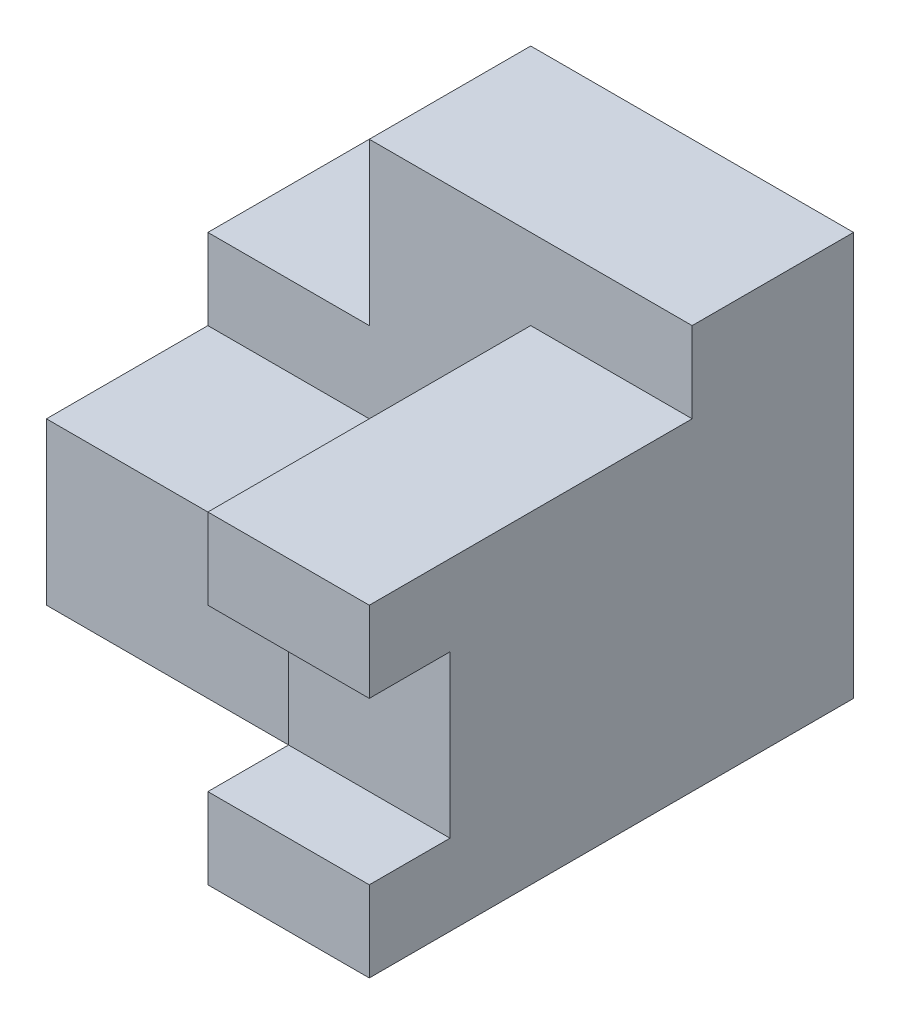
ISO-10303-21;
HEADER;
FILE_DESCRIPTION(('STEP AP214'),'2;1');
FILE_NAME('part.step','',(''),(''),'','','');
FILE_SCHEMA(('AUTOMOTIVE_DESIGN { 1 0 10303 214 1 1 1 1 }'));
ENDSEC;
DATA;
#1=APPLICATION_CONTEXT('core data for automotive mechanical design processes');
#2=APPLICATION_PROTOCOL_DEFINITION('international standard','automotive_design',2000,#1);
#3=PRODUCT_CONTEXT('',#1,'mechanical');
#4=PRODUCT('Part','Part','',(#3));
#5=PRODUCT_RELATED_PRODUCT_CATEGORY('part','',(#4));
#6=PRODUCT_DEFINITION_FORMATION('','',#4);
#7=PRODUCT_DEFINITION_CONTEXT('part definition',#1,'design');
#8=PRODUCT_DEFINITION('design','',#6,#7);
#9=PRODUCT_DEFINITION_SHAPE('','',#8);
#10=(LENGTH_UNIT() NAMED_UNIT(*) SI_UNIT(.MILLI.,.METRE.));
#11=(NAMED_UNIT(*) PLANE_ANGLE_UNIT() SI_UNIT($,.RADIAN.));
#12=(NAMED_UNIT(*) SI_UNIT($,.STERADIAN.) SOLID_ANGLE_UNIT());
#13=UNCERTAINTY_MEASURE_WITH_UNIT(LENGTH_MEASURE(1.E-05),#10,'distance_accuracy_value','');
#14=(GEOMETRIC_REPRESENTATION_CONTEXT(3) GLOBAL_UNCERTAINTY_ASSIGNED_CONTEXT((#13)) GLOBAL_UNIT_ASSIGNED_CONTEXT((#10,
#11,#12)) REPRESENTATION_CONTEXT('',''));
#15=CARTESIAN_POINT('',(0.,0.,0.));
#16=DIRECTION('',(0.,0.,1.));
#17=DIRECTION('',(1.,0.,0.));
#18=AXIS2_PLACEMENT_3D('',#15,#16,#17);
#19=CARTESIAN_POINT('',(0.,-20.,40.));
#20=DIRECTION('',(0.,-1.,0.));
#21=DIRECTION('',(1.,0.,0.));
#22=AXIS2_PLACEMENT_3D('',#19,#20,#21);
#23=PLANE('',#22);
#24=DIRECTION('',(1.,0.,0.));
#25=VECTOR('',#24,1.);
#26=CARTESIAN_POINT('',(-40.,-20.,-40.));
#27=LINE('',#26,#25);
#28=CARTESIAN_POINT('',(-120.,-20.,-40.));
#29=VERTEX_POINT('',#28);
#30=CARTESIAN_POINT('',(40.,-20.,-40.));
#31=VERTEX_POINT('',#30);
#32=EDGE_CURVE('E51',#29,#31,#27,.T.);
#33=ORIENTED_EDGE('',*,*,#32,.F.);
#34=DIRECTION('',(0.,0.,-1.));
#35=VECTOR('',#34,1.);
#36=CARTESIAN_POINT('',(-120.,-20.,40.));
#37=LINE('',#36,#35);
#38=CARTESIAN_POINT('',(-120.,-20.,40.));
#39=VERTEX_POINT('',#38);
#40=EDGE_CURVE('E159',#39,#29,#37,.T.);
#41=ORIENTED_EDGE('',*,*,#40,.F.);
#42=DIRECTION('',(-1.,0.,0.));
#43=VECTOR('',#42,1.);
#44=CARTESIAN_POINT('',(0.,-20.,40.));
#45=LINE('',#44,#43);
#46=CARTESIAN_POINT('',(40.,-20.,40.));
#47=VERTEX_POINT('',#46);
#48=EDGE_CURVE('E256',#47,#39,#45,.T.);
#49=ORIENTED_EDGE('',*,*,#48,.F.);
#50=DIRECTION('',(0.,0.,-1.));
#51=VECTOR('',#50,1.);
#52=CARTESIAN_POINT('',(40.,-20.,40.));
#53=LINE('',#52,#51);
#54=EDGE_CURVE('E271',#47,#31,#53,.T.);
#55=ORIENTED_EDGE('',*,*,#54,.T.);
#56=EDGE_LOOP('',(#33,#41,#49,#55));
#57=FACE_BOUND('',#56,.T.);
#58=ADVANCED_FACE('F34',(#57),#23,.F.);
#59=CARTESIAN_POINT('',(-40.,0.,0.));
#60=DIRECTION('',(-1.,0.,0.));
#61=DIRECTION('',(0.,-1.,0.));
#62=AXIS2_PLACEMENT_3D('',#59,#60,#61);
#63=PLANE('',#62);
#64=DIRECTION('',(0.,-1.,0.));
#65=VECTOR('',#64,1.);
#66=CARTESIAN_POINT('',(-40.,100.,-120.));
#67=LINE('',#66,#65);
#68=CARTESIAN_POINT('',(-40.,100.,-120.));
#69=VERTEX_POINT('',#68);
#70=CARTESIAN_POINT('',(-40.,20.,-120.));
#71=VERTEX_POINT('',#70);
#72=EDGE_CURVE('E175',#69,#71,#67,.T.);
#73=ORIENTED_EDGE('',*,*,#72,.T.);
#74=DIRECTION('',(0.,0.,-1.));
#75=VECTOR('',#74,1.);
#76=CARTESIAN_POINT('',(-40.,20.,-40.));
#77=LINE('',#76,#75);
#78=CARTESIAN_POINT('',(-40.,20.,-40.));
#79=VERTEX_POINT('',#78);
#80=EDGE_CURVE('E59',#79,#71,#77,.T.);
#81=ORIENTED_EDGE('',*,*,#80,.F.);
#82=DIRECTION('',(0.,1.,0.));
#83=VECTOR('',#82,1.);
#84=CARTESIAN_POINT('',(-40.,100.,-40.));
#85=LINE('',#84,#83);
#86=CARTESIAN_POINT('',(-40.,100.,-40.));
#87=VERTEX_POINT('',#86);
#88=EDGE_CURVE('E165',#79,#87,#85,.T.);
#89=ORIENTED_EDGE('',*,*,#88,.T.);
#90=DIRECTION('',(0.,0.,-1.));
#91=VECTOR('',#90,1.);
#92=CARTESIAN_POINT('',(-40.,100.,-40.));
#93=LINE('',#92,#91);
#94=EDGE_CURVE('E168',#87,#69,#93,.T.);
#95=ORIENTED_EDGE('',*,*,#94,.T.);
#96=EDGE_LOOP('',(#73,#81,#89,#95));
#97=FACE_BOUND('',#96,.T.);
#98=ADVANCED_FACE('F300',(#97),#63,.T.);
#99=CARTESIAN_POINT('',(40.,0.,120.));
#100=DIRECTION('',(1.,0.,0.));
#101=DIRECTION('',(0.,1.,0.));
#102=AXIS2_PLACEMENT_3D('',#99,#100,#101);
#103=PLANE('',#102);
#104=DIRECTION('',(0.,1.,0.));
#105=VECTOR('',#104,1.);
#106=CARTESIAN_POINT('',(40.,100.,-40.));
#107=LINE('',#106,#105);
#108=CARTESIAN_POINT('',(40.,60.,-40.));
#109=VERTEX_POINT('',#108);
#110=EDGE_CURVE('E166',#31,#109,#107,.T.);
#111=ORIENTED_EDGE('',*,*,#110,.F.);
#112=ORIENTED_EDGE('',*,*,#54,.F.);
#113=DIRECTION('',(0.,1.,0.));
#114=VECTOR('',#113,1.);
#115=CARTESIAN_POINT('',(40.,0.,40.));
#116=LINE('',#115,#114);
#117=CARTESIAN_POINT('',(40.,-100.,40.));
#118=VERTEX_POINT('',#117);
#119=EDGE_CURVE('E241',#118,#47,#116,.T.);
#120=ORIENTED_EDGE('',*,*,#119,.F.);
#121=DIRECTION('',(0.,0.,-1.));
#122=VECTOR('',#121,1.);
#123=CARTESIAN_POINT('',(40.,-100.,120.));
#124=LINE('',#123,#122);
#125=CARTESIAN_POINT('',(40.,-100.,120.));
#126=VERTEX_POINT('',#125);
#127=EDGE_CURVE('E43',#126,#118,#124,.T.);
#128=ORIENTED_EDGE('',*,*,#127,.F.);
#129=DIRECTION('',(0.,-1.,0.));
#130=VECTOR('',#129,1.);
#131=CARTESIAN_POINT('',(40.,0.,120.));
#132=LINE('',#131,#130);
#133=CARTESIAN_POINT('',(40.,-60.,120.));
#134=VERTEX_POINT('',#133);
#135=EDGE_CURVE('E276',#134,#126,#132,.T.);
#136=ORIENTED_EDGE('',*,*,#135,.F.);
#137=DIRECTION('',(0.,0.,-1.));
#138=VECTOR('',#137,1.);
#139=CARTESIAN_POINT('',(40.,-60.,120.));
#140=LINE('',#139,#138);
#141=CARTESIAN_POINT('',(40.,-60.,80.));
#142=VERTEX_POINT('',#141);
#143=EDGE_CURVE('E11',#134,#142,#140,.T.);
#144=ORIENTED_EDGE('',*,*,#143,.T.);
#145=DIRECTION('',(0.,1.,0.));
#146=VECTOR('',#145,1.);
#147=CARTESIAN_POINT('',(40.,0.,80.));
#148=LINE('',#147,#146);
#149=CARTESIAN_POINT('',(40.,20.,80.));
#150=VERTEX_POINT('',#149);
#151=EDGE_CURVE('E232',#142,#150,#148,.T.);
#152=ORIENTED_EDGE('',*,*,#151,.T.);
#153=DIRECTION('',(0.,0.,-1.));
#154=VECTOR('',#153,1.);
#155=CARTESIAN_POINT('',(40.,20.,120.));
#156=LINE('',#155,#154);
#157=CARTESIAN_POINT('',(40.,20.,120.));
#158=VERTEX_POINT('',#157);
#159=EDGE_CURVE('E250',#158,#150,#156,.T.);
#160=ORIENTED_EDGE('',*,*,#159,.F.);
#161=DIRECTION('',(0.,1.,0.));
#162=VECTOR('',#161,1.);
#163=CARTESIAN_POINT('',(40.,0.,120.));
#164=LINE('',#163,#162);
#165=CARTESIAN_POINT('',(40.,60.,120.));
#166=VERTEX_POINT('',#165);
#167=EDGE_CURVE('E216',#158,#166,#164,.T.);
#168=ORIENTED_EDGE('',*,*,#167,.T.);
#169=DIRECTION('',(0.,0.,-1.));
#170=VECTOR('',#169,1.);
#171=CARTESIAN_POINT('',(40.,60.,120.));
#172=LINE('',#171,#170);
#173=EDGE_CURVE('E196',#166,#109,#172,.T.);
#174=ORIENTED_EDGE('',*,*,#173,.T.);
#175=EDGE_LOOP('',(#111,#112,#120,#128,#136,#144,#152,#160,#168,#174));
#176=FACE_BOUND('',#175,.T.);
#177=ADVANCED_FACE('F295',(#176),#103,.F.);
#178=CARTESIAN_POINT('',(0.,-60.,120.));
#179=DIRECTION('',(0.,-1.,0.));
#180=DIRECTION('',(1.,0.,0.));
#181=AXIS2_PLACEMENT_3D('',#178,#179,#180);
#182=PLANE('',#181);
#183=DIRECTION('',(0.,0.,-1.));
#184=VECTOR('',#183,1.);
#185=CARTESIAN_POINT('',(120.,-60.,120.));
#186=LINE('',#185,#184);
#187=CARTESIAN_POINT('',(120.,-60.,120.));
#188=VERTEX_POINT('',#187);
#189=CARTESIAN_POINT('',(120.,-60.,80.));
#190=VERTEX_POINT('',#189);
#191=EDGE_CURVE('E282',#188,#190,#186,.T.);
#192=ORIENTED_EDGE('',*,*,#191,.T.);
#193=DIRECTION('',(-1.,0.,0.));
#194=VECTOR('',#193,1.);
#195=CARTESIAN_POINT('',(0.,-60.,80.));
#196=LINE('',#195,#194);
#197=EDGE_CURVE('E235',#190,#142,#196,.T.);
#198=ORIENTED_EDGE('',*,*,#197,.T.);
#199=ORIENTED_EDGE('',*,*,#143,.F.);
#200=DIRECTION('',(-1.,0.,0.));
#201=VECTOR('',#200,1.);
#202=CARTESIAN_POINT('',(0.,-60.,120.));
#203=LINE('',#202,#201);
#204=EDGE_CURVE('E273',#188,#134,#203,.T.);
#205=ORIENTED_EDGE('',*,*,#204,.F.);
#206=EDGE_LOOP('',(#192,#198,#199,#205));
#207=FACE_BOUND('',#206,.T.);
#208=ADVANCED_FACE('F36',(#207),#182,.F.);
#209=CARTESIAN_POINT('',(0.,-100.,120.));
#210=DIRECTION('',(0.,1.,0.));
#211=DIRECTION('',(0.,0.,1.));
#212=AXIS2_PLACEMENT_3D('',#209,#210,#211);
#213=PLANE('',#212);
#214=DIRECTION('',(0.,0.,-1.));
#215=VECTOR('',#214,1.);
#216=CARTESIAN_POINT('',(-120.,-100.,40.));
#217=LINE('',#216,#215);
#218=CARTESIAN_POINT('',(-120.,-100.,40.));
#219=VERTEX_POINT('',#218);
#220=CARTESIAN_POINT('',(-120.,-100.,-120.));
#221=VERTEX_POINT('',#220);
#222=EDGE_CURVE('E263',#219,#221,#217,.T.);
#223=ORIENTED_EDGE('',*,*,#222,.T.);
#224=DIRECTION('',(1.,0.,0.));
#225=VECTOR('',#224,1.);
#226=CARTESIAN_POINT('',(0.,-100.,-120.));
#227=LINE('',#226,#225);
#228=CARTESIAN_POINT('',(120.,-100.,-120.));
#229=VERTEX_POINT('',#228);
#230=EDGE_CURVE('E204',#221,#229,#227,.T.);
#231=ORIENTED_EDGE('',*,*,#230,.T.);
#232=DIRECTION('',(0.,0.,-1.));
#233=VECTOR('',#232,1.);
#234=CARTESIAN_POINT('',(120.,-100.,120.));
#235=LINE('',#234,#233);
#236=CARTESIAN_POINT('',(120.,-100.,120.));
#237=VERTEX_POINT('',#236);
#238=EDGE_CURVE('E285',#237,#229,#235,.T.);
#239=ORIENTED_EDGE('',*,*,#238,.F.);
#240=DIRECTION('',(1.,0.,0.));
#241=VECTOR('',#240,1.);
#242=CARTESIAN_POINT('',(0.,-100.,120.));
#243=LINE('',#242,#241);
#244=EDGE_CURVE('E278',#126,#237,#243,.T.);
#245=ORIENTED_EDGE('',*,*,#244,.F.);
#246=ORIENTED_EDGE('',*,*,#127,.T.);
#247=DIRECTION('',(1.,0.,0.));
#248=VECTOR('',#247,1.);
#249=CARTESIAN_POINT('',(0.,-100.,40.));
#250=LINE('',#249,#248);
#251=EDGE_CURVE('E261',#219,#118,#250,.T.);
#252=ORIENTED_EDGE('',*,*,#251,.F.);
#253=EDGE_LOOP('',(#223,#231,#239,#245,#246,#252));
#254=FACE_BOUND('',#253,.T.);
#255=ADVANCED_FACE('F292',(#254),#213,.F.);
#256=CARTESIAN_POINT('',(120.,0.,120.));
#257=DIRECTION('',(-1.,0.,0.));
#258=DIRECTION('',(0.,0.,1.));
#259=AXIS2_PLACEMENT_3D('',#256,#257,#258);
#260=PLANE('',#259);
#261=ORIENTED_EDGE('',*,*,#238,.T.);
#262=DIRECTION('',(0.,1.,0.));
#263=VECTOR('',#262,1.);
#264=CARTESIAN_POINT('',(120.,0.,-120.));
#265=LINE('',#264,#263);
#266=CARTESIAN_POINT('',(120.,100.,-120.));
#267=VERTEX_POINT('',#266);
#268=EDGE_CURVE('E208',#229,#267,#265,.T.);
#269=ORIENTED_EDGE('',*,*,#268,.T.);
#270=DIRECTION('',(0.,0.,-1.));
#271=VECTOR('',#270,1.);
#272=CARTESIAN_POINT('',(120.,100.,-120.));
#273=LINE('',#272,#271);
#274=CARTESIAN_POINT('',(120.,100.,-40.));
#275=VERTEX_POINT('',#274);
#276=EDGE_CURVE('E181',#275,#267,#273,.T.);
#277=ORIENTED_EDGE('',*,*,#276,.F.);
#278=DIRECTION('',(0.,-1.,0.));
#279=VECTOR('',#278,1.);
#280=CARTESIAN_POINT('',(120.,100.,-40.));
#281=LINE('',#280,#279);
#282=CARTESIAN_POINT('',(120.,60.,-40.));
#283=VERTEX_POINT('',#282);
#284=EDGE_CURVE('E189',#275,#283,#281,.T.);
#285=ORIENTED_EDGE('',*,*,#284,.T.);
#286=DIRECTION('',(0.,0.,-1.));
#287=VECTOR('',#286,1.);
#288=CARTESIAN_POINT('',(120.,60.,120.));
#289=LINE('',#288,#287);
#290=CARTESIAN_POINT('',(120.,60.,120.));
#291=VERTEX_POINT('',#290);
#292=EDGE_CURVE('E223',#291,#283,#289,.T.);
#293=ORIENTED_EDGE('',*,*,#292,.F.);
#294=DIRECTION('',(0.,1.,0.));
#295=VECTOR('',#294,1.);
#296=CARTESIAN_POINT('',(120.,0.,120.));
#297=LINE('',#296,#295);
#298=CARTESIAN_POINT('',(120.,20.,120.));
#299=VERTEX_POINT('',#298);
#300=EDGE_CURVE('E221',#299,#291,#297,.T.);
#301=ORIENTED_EDGE('',*,*,#300,.F.);
#302=DIRECTION('',(0.,0.,-1.));
#303=VECTOR('',#302,1.);
#304=CARTESIAN_POINT('',(120.,20.,120.));
#305=LINE('',#304,#303);
#306=CARTESIAN_POINT('',(120.,20.,80.));
#307=VERTEX_POINT('',#306);
#308=EDGE_CURVE('E229',#299,#307,#305,.T.);
#309=ORIENTED_EDGE('',*,*,#308,.T.);
#310=DIRECTION('',(0.,1.,0.));
#311=VECTOR('',#310,1.);
#312=CARTESIAN_POINT('',(120.,0.,80.));
#313=LINE('',#312,#311);
#314=EDGE_CURVE('E239',#190,#307,#313,.T.);
#315=ORIENTED_EDGE('',*,*,#314,.F.);
#316=ORIENTED_EDGE('',*,*,#191,.F.);
#317=DIRECTION('',(0.,1.,0.));
#318=VECTOR('',#317,1.);
#319=CARTESIAN_POINT('',(120.,0.,120.));
#320=LINE('',#319,#318);
#321=EDGE_CURVE('E280',#237,#188,#320,.T.);
#322=ORIENTED_EDGE('',*,*,#321,.F.);
#323=EDGE_LOOP('',(#261,#269,#277,#285,#293,#301,#309,#315,#316,#322));
#324=FACE_BOUND('',#323,.T.);
#325=ADVANCED_FACE('F312',(#324),#260,.F.);
#326=CARTESIAN_POINT('',(0.,0.,120.));
#327=DIRECTION('',(0.,0.,1.));
#328=DIRECTION('',(1.,0.,0.));
#329=AXIS2_PLACEMENT_3D('',#326,#327,#328);
#330=PLANE('',#329);
#331=ORIENTED_EDGE('',*,*,#204,.T.);
#332=ORIENTED_EDGE('',*,*,#135,.T.);
#333=ORIENTED_EDGE('',*,*,#244,.T.);
#334=ORIENTED_EDGE('',*,*,#321,.T.);
#335=EDGE_LOOP('',(#331,#332,#333,#334));
#336=FACE_BOUND('',#335,.T.);
#337=ADVANCED_FACE('F309',(#336),#330,.T.);
#338=CARTESIAN_POINT('',(-120.,0.,40.));
#339=DIRECTION('',(-1.,0.,0.));
#340=DIRECTION('',(0.,0.,1.));
#341=AXIS2_PLACEMENT_3D('',#338,#339,#340);
#342=PLANE('',#341);
#343=ORIENTED_EDGE('',*,*,#40,.T.);
#344=DIRECTION('',(0.,1.,0.));
#345=VECTOR('',#344,1.);
#346=CARTESIAN_POINT('',(-120.,-20.,-40.));
#347=LINE('',#346,#345);
#348=CARTESIAN_POINT('',(-120.,20.,-40.));
#349=VERTEX_POINT('',#348);
#350=EDGE_CURVE('E154',#29,#349,#347,.T.);
#351=ORIENTED_EDGE('',*,*,#350,.T.);
#352=DIRECTION('',(0.,0.,-1.));
#353=VECTOR('',#352,1.);
#354=CARTESIAN_POINT('',(-120.,20.,-40.));
#355=LINE('',#354,#353);
#356=CARTESIAN_POINT('',(-120.,20.,-120.));
#357=VERTEX_POINT('',#356);
#358=EDGE_CURVE('E145',#349,#357,#355,.T.);
#359=ORIENTED_EDGE('',*,*,#358,.T.);
#360=DIRECTION('',(0.,1.,0.));
#361=VECTOR('',#360,1.);
#362=CARTESIAN_POINT('',(-120.,0.,-120.));
#363=LINE('',#362,#361);
#364=EDGE_CURVE('E192',#221,#357,#363,.T.);
#365=ORIENTED_EDGE('',*,*,#364,.F.);
#366=ORIENTED_EDGE('',*,*,#222,.F.);
#367=DIRECTION('',(0.,1.,0.));
#368=VECTOR('',#367,1.);
#369=CARTESIAN_POINT('',(-120.,0.,40.));
#370=LINE('',#369,#368);
#371=EDGE_CURVE('E264',#219,#39,#370,.T.);
#372=ORIENTED_EDGE('',*,*,#371,.T.);
#373=EDGE_LOOP('',(#343,#351,#359,#365,#366,#372));
#374=FACE_BOUND('',#373,.T.);
#375=ADVANCED_FACE('F157',(#374),#342,.T.);
#376=CARTESIAN_POINT('',(0.,0.,40.));
#377=DIRECTION('',(0.,0.,1.));
#378=DIRECTION('',(1.,0.,0.));
#379=AXIS2_PLACEMENT_3D('',#376,#377,#378);
#380=PLANE('',#379);
#381=ORIENTED_EDGE('',*,*,#119,.T.);
#382=ORIENTED_EDGE('',*,*,#48,.T.);
#383=ORIENTED_EDGE('',*,*,#371,.F.);
#384=ORIENTED_EDGE('',*,*,#251,.T.);
#385=EDGE_LOOP('',(#381,#382,#383,#384));
#386=FACE_BOUND('',#385,.T.);
#387=ADVANCED_FACE('F298',(#386),#380,.T.);
#388=CARTESIAN_POINT('',(0.,0.,80.));
#389=DIRECTION('',(0.,0.,1.));
#390=DIRECTION('',(1.,0.,0.));
#391=AXIS2_PLACEMENT_3D('',#388,#389,#390);
#392=PLANE('',#391);
#393=DIRECTION('',(1.,0.,0.));
#394=VECTOR('',#393,1.);
#395=CARTESIAN_POINT('',(0.,20.,80.));
#396=LINE('',#395,#394);
#397=EDGE_CURVE('E236',#150,#307,#396,.T.);
#398=ORIENTED_EDGE('',*,*,#397,.F.);
#399=ORIENTED_EDGE('',*,*,#151,.F.);
#400=ORIENTED_EDGE('',*,*,#197,.F.);
#401=ORIENTED_EDGE('',*,*,#314,.T.);
#402=EDGE_LOOP('',(#398,#399,#400,#401));
#403=FACE_BOUND('',#402,.T.);
#404=ADVANCED_FACE('F332',(#403),#392,.T.);
#405=CARTESIAN_POINT('',(0.,20.,120.));
#406=DIRECTION('',(0.,1.,0.));
#407=DIRECTION('',(-1.,0.,0.));
#408=AXIS2_PLACEMENT_3D('',#405,#406,#407);
#409=PLANE('',#408);
#410=ORIENTED_EDGE('',*,*,#159,.T.);
#411=ORIENTED_EDGE('',*,*,#397,.T.);
#412=ORIENTED_EDGE('',*,*,#308,.F.);
#413=DIRECTION('',(1.,0.,0.));
#414=VECTOR('',#413,1.);
#415=CARTESIAN_POINT('',(0.,20.,120.));
#416=LINE('',#415,#414);
#417=EDGE_CURVE('E219',#158,#299,#416,.T.);
#418=ORIENTED_EDGE('',*,*,#417,.F.);
#419=EDGE_LOOP('',(#410,#411,#412,#418));
#420=FACE_BOUND('',#419,.T.);
#421=ADVANCED_FACE('F336',(#420),#409,.F.);
#422=CARTESIAN_POINT('',(0.,60.,120.));
#423=DIRECTION('',(0.,1.,0.));
#424=DIRECTION('',(-1.,0.,0.));
#425=AXIS2_PLACEMENT_3D('',#422,#423,#424);
#426=PLANE('',#425);
#427=DIRECTION('',(1.,0.,0.));
#428=VECTOR('',#427,1.);
#429=CARTESIAN_POINT('',(120.,60.,-40.));
#430=LINE('',#429,#428);
#431=EDGE_CURVE('E185',#109,#283,#430,.T.);
#432=ORIENTED_EDGE('',*,*,#431,.F.);
#433=ORIENTED_EDGE('',*,*,#173,.F.);
#434=DIRECTION('',(1.,0.,0.));
#435=VECTOR('',#434,1.);
#436=CARTESIAN_POINT('',(0.,60.,120.));
#437=LINE('',#436,#435);
#438=EDGE_CURVE('E211',#166,#291,#437,.T.);
#439=ORIENTED_EDGE('',*,*,#438,.T.);
#440=ORIENTED_EDGE('',*,*,#292,.T.);
#441=EDGE_LOOP('',(#432,#433,#439,#440));
#442=FACE_BOUND('',#441,.T.);
#443=ADVANCED_FACE('F344',(#442),#426,.T.);
#444=CARTESIAN_POINT('',(0.,0.,120.));
#445=DIRECTION('',(0.,0.,1.));
#446=DIRECTION('',(1.,0.,0.));
#447=AXIS2_PLACEMENT_3D('',#444,#445,#446);
#448=PLANE('',#447);
#449=ORIENTED_EDGE('',*,*,#438,.F.);
#450=ORIENTED_EDGE('',*,*,#167,.F.);
#451=ORIENTED_EDGE('',*,*,#417,.T.);
#452=ORIENTED_EDGE('',*,*,#300,.T.);
#453=EDGE_LOOP('',(#449,#450,#451,#452));
#454=FACE_BOUND('',#453,.T.);
#455=ADVANCED_FACE('F346',(#454),#448,.T.);
#456=CARTESIAN_POINT('',(0.,0.,-120.));
#457=DIRECTION('',(0.,0.,1.));
#458=DIRECTION('',(1.,0.,0.));
#459=AXIS2_PLACEMENT_3D('',#456,#457,#458);
#460=PLANE('',#459);
#461=ORIENTED_EDGE('',*,*,#364,.T.);
#462=DIRECTION('',(1.,0.,0.));
#463=VECTOR('',#462,1.);
#464=CARTESIAN_POINT('',(-120.,20.,-120.));
#465=LINE('',#464,#463);
#466=EDGE_CURVE('E151',#357,#71,#465,.T.);
#467=ORIENTED_EDGE('',*,*,#466,.T.);
#468=ORIENTED_EDGE('',*,*,#72,.F.);
#469=DIRECTION('',(-1.,0.,0.));
#470=VECTOR('',#469,1.);
#471=CARTESIAN_POINT('',(120.,100.,-120.));
#472=LINE('',#471,#470);
#473=EDGE_CURVE('E184',#267,#69,#472,.T.);
#474=ORIENTED_EDGE('',*,*,#473,.F.);
#475=ORIENTED_EDGE('',*,*,#268,.F.);
#476=ORIENTED_EDGE('',*,*,#230,.F.);
#477=EDGE_LOOP('',(#461,#467,#468,#474,#475,#476));
#478=FACE_BOUND('',#477,.T.);
#479=ADVANCED_FACE('F352',(#478),#460,.F.);
#480=CARTESIAN_POINT('',(120.,100.,-40.));
#481=DIRECTION('',(0.,0.,-1.));
#482=DIRECTION('',(-1.,0.,0.));
#483=AXIS2_PLACEMENT_3D('',#480,#481,#482);
#484=PLANE('',#483);
#485=ORIENTED_EDGE('',*,*,#431,.T.);
#486=ORIENTED_EDGE('',*,*,#284,.F.);
#487=DIRECTION('',(1.,0.,0.));
#488=VECTOR('',#487,1.);
#489=CARTESIAN_POINT('',(120.,100.,-40.));
#490=LINE('',#489,#488);
#491=EDGE_CURVE('E187',#87,#275,#490,.T.);
#492=ORIENTED_EDGE('',*,*,#491,.F.);
#493=ORIENTED_EDGE('',*,*,#88,.F.);
#494=DIRECTION('',(1.,0.,0.));
#495=VECTOR('',#494,1.);
#496=CARTESIAN_POINT('',(-120.,20.,-40.));
#497=LINE('',#496,#495);
#498=EDGE_CURVE('E149',#349,#79,#497,.T.);
#499=ORIENTED_EDGE('',*,*,#498,.F.);
#500=ORIENTED_EDGE('',*,*,#350,.F.);
#501=ORIENTED_EDGE('',*,*,#32,.T.);
#502=ORIENTED_EDGE('',*,*,#110,.T.);
#503=EDGE_LOOP('',(#485,#486,#492,#493,#499,#500,#501,#502));
#504=FACE_BOUND('',#503,.T.);
#505=ADVANCED_FACE('F163',(#504),#484,.F.);
#506=CARTESIAN_POINT('',(0.,100.,0.));
#507=DIRECTION('',(0.,-1.,0.));
#508=DIRECTION('',(1.,0.,0.));
#509=AXIS2_PLACEMENT_3D('',#506,#507,#508);
#510=PLANE('',#509);
#511=ORIENTED_EDGE('',*,*,#276,.T.);
#512=ORIENTED_EDGE('',*,*,#473,.T.);
#513=ORIENTED_EDGE('',*,*,#94,.F.);
#514=ORIENTED_EDGE('',*,*,#491,.T.);
#515=EDGE_LOOP('',(#511,#512,#513,#514));
#516=FACE_BOUND('',#515,.T.);
#517=ADVANCED_FACE('F350',(#516),#510,.F.);
#518=CARTESIAN_POINT('',(-120.,20.,-40.));
#519=DIRECTION('',(0.,-1.,0.));
#520=DIRECTION('',(1.,0.,0.));
#521=AXIS2_PLACEMENT_3D('',#518,#519,#520);
#522=PLANE('',#521);
#523=ORIENTED_EDGE('',*,*,#80,.T.);
#524=ORIENTED_EDGE('',*,*,#466,.F.);
#525=ORIENTED_EDGE('',*,*,#358,.F.);
#526=ORIENTED_EDGE('',*,*,#498,.T.);
#527=EDGE_LOOP('',(#523,#524,#525,#526));
#528=FACE_BOUND('',#527,.T.);
#529=ADVANCED_FACE('F147',(#528),#522,.F.);
#530=CLOSED_SHELL('',(#58,#98,#177,#208,#255,#325,#337,#375,#387,#404,#421,#443,#455,#479,#505,
#517,#529));
#531=MANIFOLD_SOLID_BREP('B2',#530);
#532=ADVANCED_BREP_SHAPE_REPRESENTATION('',(#18,#531),#14);
#533=SHAPE_DEFINITION_REPRESENTATION(#9,#532);
ENDSEC;
END-ISO-10303-21;
